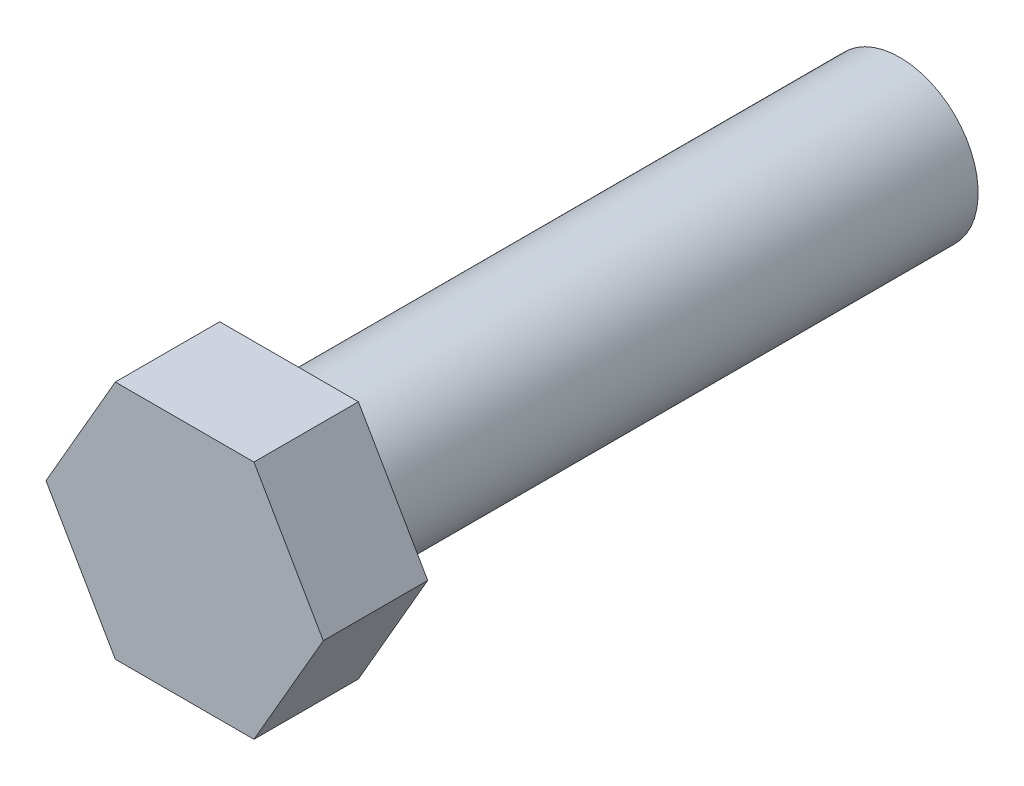
ISO-10303-21;
HEADER;
FILE_DESCRIPTION(('STEP AP214'),'2;1');
FILE_NAME('part.step','',(''),(''),'','','');
FILE_SCHEMA(('AUTOMOTIVE_DESIGN { 1 0 10303 214 1 1 1 1 }'));
ENDSEC;
DATA;
#1=APPLICATION_CONTEXT('core data for automotive mechanical design processes');
#2=APPLICATION_PROTOCOL_DEFINITION('international standard','automotive_design',2000,#1);
#3=PRODUCT_CONTEXT('',#1,'mechanical');
#4=PRODUCT('Part','Part','',(#3));
#5=PRODUCT_RELATED_PRODUCT_CATEGORY('part','',(#4));
#6=PRODUCT_DEFINITION_FORMATION('','',#4);
#7=PRODUCT_DEFINITION_CONTEXT('part definition',#1,'design');
#8=PRODUCT_DEFINITION('design','',#6,#7);
#9=PRODUCT_DEFINITION_SHAPE('','',#8);
#10=(LENGTH_UNIT() NAMED_UNIT(*) SI_UNIT(.MILLI.,.METRE.));
#11=(NAMED_UNIT(*) PLANE_ANGLE_UNIT() SI_UNIT($,.RADIAN.));
#12=(NAMED_UNIT(*) SI_UNIT($,.STERADIAN.) SOLID_ANGLE_UNIT());
#13=UNCERTAINTY_MEASURE_WITH_UNIT(LENGTH_MEASURE(1.E-05),#10,'distance_accuracy_value','');
#14=(GEOMETRIC_REPRESENTATION_CONTEXT(3) GLOBAL_UNCERTAINTY_ASSIGNED_CONTEXT((#13)) GLOBAL_UNIT_ASSIGNED_CONTEXT((#10,
#11,#12)) REPRESENTATION_CONTEXT('',''));
#15=CARTESIAN_POINT('',(0.,0.,0.));
#16=DIRECTION('',(0.,0.,1.));
#17=DIRECTION('',(1.,0.,0.));
#18=AXIS2_PLACEMENT_3D('',#15,#16,#17);
#19=CARTESIAN_POINT('',(13.2790561913616,-22.9999999999998,-20.));
#20=DIRECTION('',(0.866025403784442,-0.499999999999995,0.));
#21=DIRECTION('',(0.499999999999995,0.866025403784442,0.));
#22=AXIS2_PLACEMENT_3D('',#19,#20,#21);
#23=PLANE('',#22);
#24=DIRECTION('',(0.499999999999995,0.866025403784442,0.));
#25=VECTOR('',#24,1.);
#26=CARTESIAN_POINT('',(13.2790561913616,-22.9999999999998,0.));
#27=LINE('',#26,#25);
#28=CARTESIAN_POINT('',(13.2790561913616,-22.9999999999998,0.));
#29=VERTEX_POINT('',#28);
#30=CARTESIAN_POINT('',(26.5581123827227,0.,0.));
#31=VERTEX_POINT('',#30);
#32=EDGE_CURVE('E124',#29,#31,#27,.T.);
#33=ORIENTED_EDGE('',*,*,#32,.F.);
#34=DIRECTION('',(0.,0.,1.));
#35=VECTOR('',#34,1.);
#36=CARTESIAN_POINT('',(13.2790561913616,-22.9999999999998,-20.));
#37=LINE('',#36,#35);
#38=CARTESIAN_POINT('',(13.2790561913616,-22.9999999999998,-20.));
#39=VERTEX_POINT('',#38);
#40=EDGE_CURVE('E46',#39,#29,#37,.T.);
#41=ORIENTED_EDGE('',*,*,#40,.F.);
#42=DIRECTION('',(0.499999999999995,0.866025403784442,0.));
#43=VECTOR('',#42,1.);
#44=CARTESIAN_POINT('',(13.2790561913616,-22.9999999999998,-20.));
#45=LINE('',#44,#43);
#46=CARTESIAN_POINT('',(26.5581123827227,0.,-20.));
#47=VERTEX_POINT('',#46);
#48=EDGE_CURVE('E140',#39,#47,#45,.T.);
#49=ORIENTED_EDGE('',*,*,#48,.T.);
#50=DIRECTION('',(0.,0.,1.));
#51=VECTOR('',#50,1.);
#52=CARTESIAN_POINT('',(26.5581123827227,0.,-20.));
#53=LINE('',#52,#51);
#54=EDGE_CURVE('E40',#47,#31,#53,.T.);
#55=ORIENTED_EDGE('',*,*,#54,.T.);
#56=EDGE_LOOP('',(#33,#41,#49,#55));
#57=FACE_BOUND('',#56,.T.);
#58=ADVANCED_FACE('F37',(#57),#23,.T.);
#59=CARTESIAN_POINT('',(-13.2790561913611,-23.,-20.));
#60=DIRECTION('',(0.,-1.,0.));
#61=DIRECTION('',(1.,0.,0.));
#62=AXIS2_PLACEMENT_3D('',#59,#60,#61);
#63=PLANE('',#62);
#64=DIRECTION('',(1.,0.,0.));
#65=VECTOR('',#64,1.);
#66=CARTESIAN_POINT('',(-13.2790561913611,-23.,0.));
#67=LINE('',#66,#65);
#68=CARTESIAN_POINT('',(-13.2790561913611,-23.,0.));
#69=VERTEX_POINT('',#68);
#70=EDGE_CURVE('E137',#69,#29,#67,.T.);
#71=ORIENTED_EDGE('',*,*,#70,.F.);
#72=DIRECTION('',(0.,0.,1.));
#73=VECTOR('',#72,1.);
#74=CARTESIAN_POINT('',(-13.2790561913611,-23.,-20.));
#75=LINE('',#74,#73);
#76=CARTESIAN_POINT('',(-13.2790561913611,-23.,-20.));
#77=VERTEX_POINT('',#76);
#78=EDGE_CURVE('E77',#77,#69,#75,.T.);
#79=ORIENTED_EDGE('',*,*,#78,.F.);
#80=DIRECTION('',(1.,0.,0.));
#81=VECTOR('',#80,1.);
#82=CARTESIAN_POINT('',(-13.2790561913611,-23.,-20.));
#83=LINE('',#82,#81);
#84=EDGE_CURVE('E114',#77,#39,#83,.T.);
#85=ORIENTED_EDGE('',*,*,#84,.T.);
#86=ORIENTED_EDGE('',*,*,#40,.T.);
#87=EDGE_LOOP('',(#71,#79,#85,#86));
#88=FACE_BOUND('',#87,.T.);
#89=ADVANCED_FACE('F148',(#88),#63,.T.);
#90=CARTESIAN_POINT('',(-26.5581123827227,-1.8545430755835E-13,-20.));
#91=DIRECTION('',(-0.866025403784435,-0.500000000000007,0.));
#92=DIRECTION('',(0.500000000000007,-0.866025403784435,0.));
#93=AXIS2_PLACEMENT_3D('',#90,#91,#92);
#94=PLANE('',#93);
#95=DIRECTION('',(0.500000000000007,-0.866025403784434,0.));
#96=VECTOR('',#95,1.);
#97=CARTESIAN_POINT('',(-26.5581123827227,-1.8545430755835E-13,0.));
#98=LINE('',#97,#96);
#99=CARTESIAN_POINT('',(-26.5581123827227,-1.8545430755835E-13,0.));
#100=VERTEX_POINT('',#99);
#101=EDGE_CURVE('E101',#100,#69,#98,.T.);
#102=ORIENTED_EDGE('',*,*,#101,.F.);
#103=DIRECTION('',(0.,0.,1.));
#104=VECTOR('',#103,1.);
#105=CARTESIAN_POINT('',(-26.5581123827227,-1.8545430755835E-13,-20.));
#106=LINE('',#105,#104);
#107=CARTESIAN_POINT('',(-26.5581123827227,-1.8545430755835E-13,-20.));
#108=VERTEX_POINT('',#107);
#109=EDGE_CURVE('E96',#108,#100,#106,.T.);
#110=ORIENTED_EDGE('',*,*,#109,.F.);
#111=DIRECTION('',(0.500000000000007,-0.866025403784434,0.));
#112=VECTOR('',#111,1.);
#113=CARTESIAN_POINT('',(-26.5581123827227,-1.8545430755835E-13,-20.));
#114=LINE('',#113,#112);
#115=EDGE_CURVE('E99',#108,#77,#114,.T.);
#116=ORIENTED_EDGE('',*,*,#115,.T.);
#117=ORIENTED_EDGE('',*,*,#78,.T.);
#118=EDGE_LOOP('',(#102,#110,#116,#117));
#119=FACE_BOUND('',#118,.T.);
#120=ADVANCED_FACE('F98',(#119),#94,.T.);
#121=CARTESIAN_POINT('',(-13.2790561913615,22.9999999999999,-20.));
#122=DIRECTION('',(-0.866025403784442,0.499999999999995,0.));
#123=DIRECTION('',(-0.499999999999995,-0.866025403784442,0.));
#124=AXIS2_PLACEMENT_3D('',#121,#122,#123);
#125=PLANE('',#124);
#126=DIRECTION('',(-0.499999999999995,-0.866025403784442,0.));
#127=VECTOR('',#126,1.);
#128=CARTESIAN_POINT('',(-13.2790561913615,22.9999999999999,0.));
#129=LINE('',#128,#127);
#130=CARTESIAN_POINT('',(-13.2790561913615,22.9999999999999,0.));
#131=VERTEX_POINT('',#130);
#132=EDGE_CURVE('E134',#131,#100,#129,.T.);
#133=ORIENTED_EDGE('',*,*,#132,.F.);
#134=DIRECTION('',(0.,0.,1.));
#135=VECTOR('',#134,1.);
#136=CARTESIAN_POINT('',(-13.2790561913615,22.9999999999999,-20.));
#137=LINE('',#136,#135);
#138=CARTESIAN_POINT('',(-13.2790561913615,22.9999999999999,-20.));
#139=VERTEX_POINT('',#138);
#140=EDGE_CURVE('E106',#139,#131,#137,.T.);
#141=ORIENTED_EDGE('',*,*,#140,.F.);
#142=DIRECTION('',(-0.499999999999995,-0.866025403784442,0.));
#143=VECTOR('',#142,1.);
#144=CARTESIAN_POINT('',(-13.2790561913615,22.9999999999999,-20.));
#145=LINE('',#144,#143);
#146=EDGE_CURVE('E112',#139,#108,#145,.T.);
#147=ORIENTED_EDGE('',*,*,#146,.T.);
#148=ORIENTED_EDGE('',*,*,#109,.T.);
#149=EDGE_LOOP('',(#133,#141,#147,#148));
#150=FACE_BOUND('',#149,.T.);
#151=ADVANCED_FACE('F116',(#150),#125,.T.);
#152=CARTESIAN_POINT('',(13.2790561913613,23.,-20.));
#153=DIRECTION('',(0.,1.,0.));
#154=DIRECTION('',(-1.,0.,0.));
#155=AXIS2_PLACEMENT_3D('',#152,#153,#154);
#156=PLANE('',#155);
#157=DIRECTION('',(-1.,0.,0.));
#158=VECTOR('',#157,1.);
#159=CARTESIAN_POINT('',(13.2790561913613,23.,0.));
#160=LINE('',#159,#158);
#161=CARTESIAN_POINT('',(13.2790561913613,23.,0.));
#162=VERTEX_POINT('',#161);
#163=EDGE_CURVE('E131',#162,#131,#160,.T.);
#164=ORIENTED_EDGE('',*,*,#163,.F.);
#165=DIRECTION('',(0.,0.,1.));
#166=VECTOR('',#165,1.);
#167=CARTESIAN_POINT('',(13.2790561913613,23.,-20.));
#168=LINE('',#167,#166);
#169=CARTESIAN_POINT('',(13.2790561913613,23.,-20.));
#170=VERTEX_POINT('',#169);
#171=EDGE_CURVE('E143',#170,#162,#168,.T.);
#172=ORIENTED_EDGE('',*,*,#171,.F.);
#173=DIRECTION('',(-1.,0.,0.));
#174=VECTOR('',#173,1.);
#175=CARTESIAN_POINT('',(13.2790561913613,23.,-20.));
#176=LINE('',#175,#174);
#177=EDGE_CURVE('E117',#170,#139,#176,.T.);
#178=ORIENTED_EDGE('',*,*,#177,.T.);
#179=ORIENTED_EDGE('',*,*,#140,.T.);
#180=EDGE_LOOP('',(#164,#172,#178,#179));
#181=FACE_BOUND('',#180,.T.);
#182=ADVANCED_FACE('F161',(#181),#156,.T.);
#183=CARTESIAN_POINT('',(26.5581123827227,0.,-20.));
#184=DIRECTION('',(0.866025403784438,0.500000000000001,0.));
#185=DIRECTION('',(-0.500000000000001,0.866025403784438,0.));
#186=AXIS2_PLACEMENT_3D('',#183,#184,#185);
#187=PLANE('',#186);
#188=DIRECTION('',(-0.500000000000001,0.866025403784438,0.));
#189=VECTOR('',#188,1.);
#190=CARTESIAN_POINT('',(26.5581123827227,0.,0.));
#191=LINE('',#190,#189);
#192=EDGE_CURVE('E127',#31,#162,#191,.T.);
#193=ORIENTED_EDGE('',*,*,#192,.F.);
#194=ORIENTED_EDGE('',*,*,#54,.F.);
#195=DIRECTION('',(-0.500000000000001,0.866025403784438,0.));
#196=VECTOR('',#195,1.);
#197=CARTESIAN_POINT('',(26.5581123827227,0.,-20.));
#198=LINE('',#197,#196);
#199=EDGE_CURVE('E119',#47,#170,#198,.T.);
#200=ORIENTED_EDGE('',*,*,#199,.T.);
#201=ORIENTED_EDGE('',*,*,#171,.T.);
#202=EDGE_LOOP('',(#193,#194,#200,#201));
#203=FACE_BOUND('',#202,.T.);
#204=ADVANCED_FACE('F145',(#203),#187,.T.);
#205=CARTESIAN_POINT('',(0.,0.,-20.));
#206=DIRECTION('',(0.,0.,1.));
#207=DIRECTION('',(1.,0.,0.));
#208=AXIS2_PLACEMENT_3D('',#205,#206,#207);
#209=PLANE('',#208);
#210=CARTESIAN_POINT('',(0.,0.,-20.));
#211=DIRECTION('',(0.,0.,-1.));
#212=DIRECTION('',(-1.,0.,0.));
#213=AXIS2_PLACEMENT_3D('',#210,#211,#212);
#214=CIRCLE('',#213,15.);
#215=CARTESIAN_POINT('',(-15.,0.,-20.));
#216=VERTEX_POINT('',#215);
#217=EDGE_CURVE('E11',#216,#216,#214,.T.);
#218=ORIENTED_EDGE('',*,*,#217,.F.);
#219=EDGE_LOOP('',(#218));
#220=FACE_BOUND('',#219,.T.);
#221=ORIENTED_EDGE('',*,*,#48,.F.);
#222=ORIENTED_EDGE('',*,*,#84,.F.);
#223=ORIENTED_EDGE('',*,*,#115,.F.);
#224=ORIENTED_EDGE('',*,*,#146,.F.);
#225=ORIENTED_EDGE('',*,*,#177,.F.);
#226=ORIENTED_EDGE('',*,*,#199,.F.);
#227=EDGE_LOOP('',(#221,#222,#223,#224,#225,#226));
#228=FACE_BOUND('',#227,.T.);
#229=ADVANCED_FACE('F110',(#220,#228),#209,.F.);
#230=CARTESIAN_POINT('',(0.,0.,0.));
#231=DIRECTION('',(0.,0.,1.));
#232=DIRECTION('',(1.,0.,0.));
#233=AXIS2_PLACEMENT_3D('',#230,#231,#232);
#234=PLANE('',#233);
#235=ORIENTED_EDGE('',*,*,#32,.T.);
#236=ORIENTED_EDGE('',*,*,#192,.T.);
#237=ORIENTED_EDGE('',*,*,#163,.T.);
#238=ORIENTED_EDGE('',*,*,#132,.T.);
#239=ORIENTED_EDGE('',*,*,#101,.T.);
#240=ORIENTED_EDGE('',*,*,#70,.T.);
#241=EDGE_LOOP('',(#235,#236,#237,#238,#239,#240));
#242=FACE_BOUND('',#241,.T.);
#243=ADVANCED_FACE('F147',(#242),#234,.T.);
#244=CARTESIAN_POINT('',(0.,0.,-137.));
#245=DIRECTION('',(0.,0.,1.));
#246=DIRECTION('',(1.,0.,0.));
#247=AXIS2_PLACEMENT_3D('',#244,#245,#246);
#248=CYLINDRICAL_SURFACE('',#247,15.);
#249=CARTESIAN_POINT('',(0.,0.,-137.));
#250=DIRECTION('',(0.,0.,-1.));
#251=DIRECTION('',(-1.,0.,0.));
#252=AXIS2_PLACEMENT_3D('',#249,#250,#251);
#253=CIRCLE('',#252,15.);
#254=CARTESIAN_POINT('',(-15.,0.,-137.));
#255=VERTEX_POINT('',#254);
#256=EDGE_CURVE('E128',#255,#255,#253,.T.);
#257=ORIENTED_EDGE('',*,*,#256,.F.);
#258=EDGE_LOOP('',(#257));
#259=FACE_BOUND('',#258,.T.);
#260=ORIENTED_EDGE('',*,*,#217,.T.);
#261=EDGE_LOOP('',(#260));
#262=FACE_BOUND('',#261,.T.);
#263=ADVANCED_FACE('F172',(#259,#262),#248,.T.);
#264=CARTESIAN_POINT('',(0.,0.,-137.));
#265=DIRECTION('',(0.,0.,-1.));
#266=DIRECTION('',(-1.,0.,0.));
#267=AXIS2_PLACEMENT_3D('',#264,#265,#266);
#268=PLANE('',#267);
#269=ORIENTED_EDGE('',*,*,#256,.T.);
#270=EDGE_LOOP('',(#269));
#271=FACE_BOUND('',#270,.T.);
#272=ADVANCED_FACE('F177',(#271),#268,.T.);
#273=CLOSED_SHELL('',(#58,#89,#120,#151,#182,#204,#229,#243,#263,#272));
#274=MANIFOLD_SOLID_BREP('B2',#273);
#275=ADVANCED_BREP_SHAPE_REPRESENTATION('',(#18,#274),#14);
#276=SHAPE_DEFINITION_REPRESENTATION(#9,#275);
ENDSEC;
END-ISO-10303-21;
